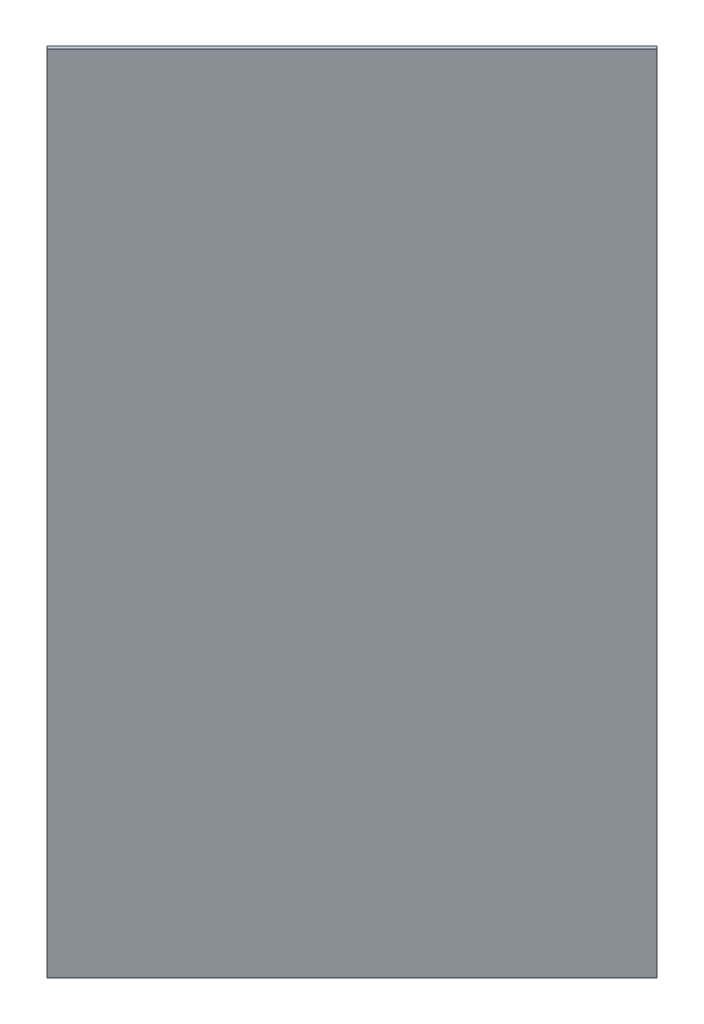
ISO-10303-21;
HEADER;
FILE_DESCRIPTION(('STEP AP214'),'2;1');
FILE_NAME('part.step','',(''),(''),'','','');
FILE_SCHEMA(('AUTOMOTIVE_DESIGN { 1 0 10303 214 1 1 1 1 }'));
ENDSEC;
DATA;
#1=APPLICATION_CONTEXT('core data for automotive mechanical design processes');
#2=APPLICATION_PROTOCOL_DEFINITION('international standard','automotive_design',2000,#1);
#3=PRODUCT_CONTEXT('',#1,'mechanical');
#4=PRODUCT('Part','Part','',(#3));
#5=PRODUCT_RELATED_PRODUCT_CATEGORY('part','',(#4));
#6=PRODUCT_DEFINITION_FORMATION('','',#4);
#7=PRODUCT_DEFINITION_CONTEXT('part definition',#1,'design');
#8=PRODUCT_DEFINITION('design','',#6,#7);
#9=PRODUCT_DEFINITION_SHAPE('','',#8);
#10=(LENGTH_UNIT() NAMED_UNIT(*) SI_UNIT(.MILLI.,.METRE.));
#11=(NAMED_UNIT(*) PLANE_ANGLE_UNIT() SI_UNIT($,.RADIAN.));
#12=(NAMED_UNIT(*) SI_UNIT($,.STERADIAN.) SOLID_ANGLE_UNIT());
#13=UNCERTAINTY_MEASURE_WITH_UNIT(LENGTH_MEASURE(1.E-05),#10,'distance_accuracy_value','');
#14=(GEOMETRIC_REPRESENTATION_CONTEXT(3) GLOBAL_UNCERTAINTY_ASSIGNED_CONTEXT((#13)) GLOBAL_UNIT_ASSIGNED_CONTEXT((#10,
#11,#12)) REPRESENTATION_CONTEXT('',''));
#15=CARTESIAN_POINT('',(0.,0.,0.));
#16=DIRECTION('',(0.,0.,1.));
#17=DIRECTION('',(1.,0.,0.));
#18=AXIS2_PLACEMENT_3D('',#15,#16,#17);
#19=CARTESIAN_POINT('',(4.46995674892038,70.5839999999999,-36.0340635300999));
#20=DIRECTION('',(0.707106781186548,0.,0.707106781186548));
#21=DIRECTION('',(0.707106781186548,0.,-0.707106781186548));
#22=AXIS2_PLACEMENT_3D('',#19,#20,#21);
#23=PLANE('',#22);
#24=DIRECTION('',(0.,1.,0.));
#25=VECTOR('',#24,1.);
#26=CARTESIAN_POINT('',(24.1951118138242,70.5839999999999,-55.7592185950038));
#27=LINE('',#26,#25);
#28=CARTESIAN_POINT('',(24.1951118138242,-29.0300000000001,-55.7592185950038));
#29=VERTEX_POINT('',#28);
#30=CARTESIAN_POINT('',(24.1951118138242,93.18,-55.7592185950038));
#31=VERTEX_POINT('',#30);
#32=EDGE_CURVE('E127',#29,#31,#27,.T.);
#33=ORIENTED_EDGE('',*,*,#32,.F.);
#34=DIRECTION('',(-0.707106781186548,0.,0.707106781186548));
#35=VECTOR('',#34,1.);
#36=CARTESIAN_POINT('',(4.46995674892038,-29.0300000000001,-36.0340635300999));
#37=LINE('',#36,#35);
#38=CARTESIAN_POINT('',(-23.4855098452948,-29.0300000000001,-8.07859693588471));
#39=VERTEX_POINT('',#38);
#40=EDGE_CURVE('E143',#29,#39,#37,.T.);
#41=ORIENTED_EDGE('',*,*,#40,.T.);
#42=DIRECTION('',(0.,1.,0.));
#43=VECTOR('',#42,1.);
#44=CARTESIAN_POINT('',(-23.4855098452948,70.5839999999999,-8.07859693588471));
#45=LINE('',#44,#43);
#46=CARTESIAN_POINT('',(-23.4855098452948,93.18,-8.07859693588471));
#47=VERTEX_POINT('',#46);
#48=EDGE_CURVE('E109',#39,#47,#45,.T.);
#49=ORIENTED_EDGE('',*,*,#48,.T.);
#50=DIRECTION('',(0.707106781186548,0.,-0.707106781186548));
#51=VECTOR('',#50,1.);
#52=CARTESIAN_POINT('',(4.46995674892038,93.18,-36.0340635300999));
#53=LINE('',#52,#51);
#54=EDGE_CURVE('E141',#47,#31,#53,.T.);
#55=ORIENTED_EDGE('',*,*,#54,.T.);
#56=EDGE_LOOP('',(#33,#41,#49,#55));
#57=FACE_BOUND('',#56,.T.);
#58=ADVANCED_FACE('F45',(#57),#23,.F.);
#59=CARTESIAN_POINT('',(-27.0952899632386,-30.7800000000001,-6.59013716150293));
#60=DIRECTION('',(0.,1.,0.));
#61=DIRECTION('',(0.,0.,1.));
#62=AXIS2_PLACEMENT_3D('',#59,#60,#61);
#63=PLANE('',#62);
#64=DIRECTION('',(-0.707106781186548,0.,-0.707106781186548));
#65=VECTOR('',#64,1.);
#66=CARTESIAN_POINT('',(-24.5461700170758,-30.7800000000001,-9.13925710766571));
#67=LINE('',#66,#65);
#68=CARTESIAN_POINT('',(-22.0712962829183,-30.7800000000001,-6.66438337350821));
#69=VERTEX_POINT('',#68);
#70=CARTESIAN_POINT('',(-22.4471770265258,-30.7800000000001,-7.04026411711569));
#71=VERTEX_POINT('',#70);
#72=EDGE_CURVE('E124',#69,#71,#67,.T.);
#73=ORIENTED_EDGE('',*,*,#72,.T.);
#74=DIRECTION('',(0.707106781186548,0.,-0.707106781186548));
#75=VECTOR('',#74,1.);
#76=CARTESIAN_POINT('',(-24.9962969726886,-30.7800000000001,-4.49114417095292));
#77=LINE('',#76,#75);
#78=CARTESIAN_POINT('',(25.2334446325932,-30.7800000000001,-54.7208857762348));
#79=VERTEX_POINT('',#78);
#80=EDGE_CURVE('E131',#71,#79,#77,.T.);
#81=ORIENTED_EDGE('',*,*,#80,.T.);
#82=DIRECTION('',(-0.707106781186548,0.,-0.707106781186548));
#83=VECTOR('',#82,1.);
#84=CARTESIAN_POINT('',(23.1344516420432,-30.7800000000001,-56.8198787667848));
#85=LINE('',#84,#83);
#86=CARTESIAN_POINT('',(25.6093253762007,-30.7800000000001,-54.3450050326273));
#87=VERTEX_POINT('',#86);
#88=EDGE_CURVE('E110',#87,#79,#85,.T.);
#89=ORIENTED_EDGE('',*,*,#88,.F.);
#90=DIRECTION('',(0.707106781186548,0.,-0.707106781186548));
#91=VECTOR('',#90,1.);
#92=CARTESIAN_POINT('',(-24.6204162290811,-30.7800000000001,-4.11526342734543));
#93=LINE('',#92,#91);
#94=EDGE_CURVE('E122',#69,#87,#93,.T.);
#95=ORIENTED_EDGE('',*,*,#94,.F.);
#96=EDGE_LOOP('',(#73,#81,#89,#95));
#97=FACE_BOUND('',#96,.T.);
#98=ADVANCED_FACE('F152',(#97),#63,.F.);
#99=CARTESIAN_POINT('',(24.5486652044197,31.9999999999999,-55.4056652044083));
#100=DIRECTION('',(0.707106781186548,0.,-0.707106781186548));
#101=DIRECTION('',(-0.707106781186548,0.,-0.707106781186548));
#102=AXIS2_PLACEMENT_3D('',#99,#100,#101);
#103=PLANE('',#102);
#104=ORIENTED_EDGE('',*,*,#88,.T.);
#105=DIRECTION('',(0.454519477672042,-0.766044443118979,0.454519477672042));
#106=VECTOR('',#105,1.);
#107=CARTESIAN_POINT('',(3.09163676476418,6.53767220325186,-76.8626936440638));
#108=LINE('',#107,#106);
#109=EDGE_CURVE('E139',#79,#29,#108,.F.);
#110=ORIENTED_EDGE('',*,*,#109,.T.);
#111=ORIENTED_EDGE('',*,*,#32,.T.);
#112=DIRECTION('',(-0.454519477672042,-0.76604444311898,-0.454519477672042));
#113=VECTOR('',#112,1.);
#114=CARTESIAN_POINT('',(3.03940944674019,57.5243041834229,-76.9149209620878));
#115=LINE('',#114,#113);
#116=CARTESIAN_POINT('',(25.2334446325933,94.93,-54.7208857762348));
#117=VERTEX_POINT('',#116);
#118=EDGE_CURVE('E107',#31,#117,#115,.F.);
#119=ORIENTED_EDGE('',*,*,#118,.T.);
#120=DIRECTION('',(0.707106781186548,0.,0.707106781186548));
#121=VECTOR('',#120,1.);
#122=CARTESIAN_POINT('',(23.1344516420397,94.93,-56.8198787667883));
#123=LINE('',#122,#121);
#124=CARTESIAN_POINT('',(25.6093253762007,94.93,-54.3450050326273));
#125=VERTEX_POINT('',#124);
#126=EDGE_CURVE('E98',#117,#125,#123,.T.);
#127=ORIENTED_EDGE('',*,*,#126,.T.);
#128=DIRECTION('',(0.,1.,0.));
#129=VECTOR('',#128,1.);
#130=CARTESIAN_POINT('',(25.6093253762007,70.5839999999999,-54.3450050326273));
#131=LINE('',#130,#129);
#132=EDGE_CURVE('E103',#87,#125,#131,.T.);
#133=ORIENTED_EDGE('',*,*,#132,.F.);
#134=EDGE_LOOP('',(#104,#110,#111,#119,#127,#133));
#135=FACE_BOUND('',#134,.T.);
#136=ADVANCED_FACE('F101',(#135),#103,.T.);
#137=CARTESIAN_POINT('',(22.8374667939414,94.93,-56.5228939186899));
#138=DIRECTION('',(0.,-1.,0.));
#139=DIRECTION('',(0.,0.,-1.));
#140=AXIS2_PLACEMENT_3D('',#137,#138,#139);
#141=PLANE('',#140);
#142=ORIENTED_EDGE('',*,*,#126,.F.);
#143=DIRECTION('',(-0.707106781186548,0.,0.707106781186548));
#144=VECTOR('',#143,1.);
#145=CARTESIAN_POINT('',(24.9364597844949,94.93,-54.4239009281364));
#146=LINE('',#145,#144);
#147=CARTESIAN_POINT('',(-22.4471770265258,94.93,-7.0402641171157));
#148=VERTEX_POINT('',#147);
#149=EDGE_CURVE('E12',#117,#148,#146,.T.);
#150=ORIENTED_EDGE('',*,*,#149,.T.);
#151=DIRECTION('',(0.707106781186548,0.,0.707106781186548));
#152=VECTOR('',#151,1.);
#153=CARTESIAN_POINT('',(-24.5461700170793,94.93,-9.13925710766923));
#154=LINE('',#153,#152);
#155=CARTESIAN_POINT('',(-22.0712962829183,94.93,-6.66438337350822));
#156=VERTEX_POINT('',#155);
#157=EDGE_CURVE('E115',#148,#156,#154,.T.);
#158=ORIENTED_EDGE('',*,*,#157,.T.);
#159=DIRECTION('',(-0.707106781186548,0.,0.707106781186548));
#160=VECTOR('',#159,1.);
#161=CARTESIAN_POINT('',(25.3123405281024,94.93,-54.0480201845289));
#162=LINE('',#161,#160);
#163=EDGE_CURVE('E113',#125,#156,#162,.T.);
#164=ORIENTED_EDGE('',*,*,#163,.F.);
#165=EDGE_LOOP('',(#142,#150,#158,#164));
#166=FACE_BOUND('',#165,.T.);
#167=ADVANCED_FACE('F114',(#166),#141,.F.);
#168=CARTESIAN_POINT('',(-23.1319564547013,30.9999999999999,-7.72504354529121));
#169=DIRECTION('',(0.707106781186548,0.,-0.707106781186548));
#170=DIRECTION('',(-0.707106781186548,0.,-0.707106781186548));
#171=AXIS2_PLACEMENT_3D('',#168,#169,#170);
#172=PLANE('',#171);
#173=ORIENTED_EDGE('',*,*,#48,.F.);
#174=DIRECTION('',(-0.454519477672042,0.766044443118979,-0.454519477672042));
#175=VECTOR('',#174,1.);
#176=CARTESIAN_POINT('',(-22.4471770265258,-30.7800000000001,-7.04026411711569));
#177=LINE('',#176,#175);
#178=EDGE_CURVE('E53',#39,#71,#177,.F.);
#179=ORIENTED_EDGE('',*,*,#178,.T.);
#180=ORIENTED_EDGE('',*,*,#72,.F.);
#181=DIRECTION('',(0.,-1.,0.));
#182=VECTOR('',#181,1.);
#183=CARTESIAN_POINT('',(-22.0712962829183,30.9999999999999,-6.66438337350821));
#184=LINE('',#183,#182);
#185=EDGE_CURVE('E119',#156,#69,#184,.T.);
#186=ORIENTED_EDGE('',*,*,#185,.F.);
#187=ORIENTED_EDGE('',*,*,#157,.F.);
#188=DIRECTION('',(0.454519477672042,0.76604444311898,0.454519477672042));
#189=VECTOR('',#188,1.);
#190=CARTESIAN_POINT('',(-22.4471770265258,94.93,-7.0402641171157));
#191=LINE('',#190,#189);
#192=EDGE_CURVE('E60',#148,#47,#191,.F.);
#193=ORIENTED_EDGE('',*,*,#192,.T.);
#194=EDGE_LOOP('',(#173,#179,#180,#186,#187,#193));
#195=FACE_BOUND('',#194,.T.);
#196=ADVANCED_FACE('F147',(#195),#172,.F.);
#197=CARTESIAN_POINT('',(5.88417031129338,70.5839999999999,-34.6198499677199));
#198=DIRECTION('',(0.707106781186548,0.,0.707106781186548));
#199=DIRECTION('',(0.707106781186548,0.,-0.707106781186548));
#200=AXIS2_PLACEMENT_3D('',#197,#198,#199);
#201=PLANE('',#200);
#202=ORIENTED_EDGE('',*,*,#163,.T.);
#203=ORIENTED_EDGE('',*,*,#185,.T.);
#204=ORIENTED_EDGE('',*,*,#94,.T.);
#205=ORIENTED_EDGE('',*,*,#132,.T.);
#206=EDGE_LOOP('',(#202,#203,#204,#205));
#207=FACE_BOUND('',#206,.T.);
#208=ADVANCED_FACE('F121',(#207),#201,.T.);
#209=CARTESIAN_POINT('',(-24.9962969726886,-30.7800000000001,-4.49114417095291));
#210=DIRECTION('',(0.541675220419703,0.642787609686538,0.541675220419703));
#211=DIRECTION('',(0.707106781186548,0.,-0.707106781186548));
#212=AXIS2_PLACEMENT_3D('',#209,#210,#211);
#213=PLANE('',#212);
#214=ORIENTED_EDGE('',*,*,#178,.F.);
#215=ORIENTED_EDGE('',*,*,#40,.F.);
#216=ORIENTED_EDGE('',*,*,#109,.F.);
#217=ORIENTED_EDGE('',*,*,#80,.F.);
#218=EDGE_LOOP('',(#214,#215,#216,#217));
#219=FACE_BOUND('',#218,.T.);
#220=ADVANCED_FACE('F153',(#219),#213,.F.);
#221=CARTESIAN_POINT('',(24.9364597844949,94.93,-54.4239009281364));
#222=DIRECTION('',(0.541675220419703,-0.642787609686537,0.541675220419703));
#223=DIRECTION('',(-0.707106781186548,0.,0.707106781186548));
#224=AXIS2_PLACEMENT_3D('',#221,#222,#223);
#225=PLANE('',#224);
#226=ORIENTED_EDGE('',*,*,#118,.F.);
#227=ORIENTED_EDGE('',*,*,#54,.F.);
#228=ORIENTED_EDGE('',*,*,#192,.F.);
#229=ORIENTED_EDGE('',*,*,#149,.F.);
#230=EDGE_LOOP('',(#226,#227,#228,#229));
#231=FACE_BOUND('',#230,.T.);
#232=ADVANCED_FACE('F47',(#231),#225,.F.);
#233=CLOSED_SHELL('',(#58,#98,#136,#167,#196,#208,#220,#232));
#234=MANIFOLD_SOLID_BREP('B2',#233);
#235=ADVANCED_BREP_SHAPE_REPRESENTATION('',(#18,#234),#14);
#236=SHAPE_DEFINITION_REPRESENTATION(#9,#235);
ENDSEC;
END-ISO-10303-21;
